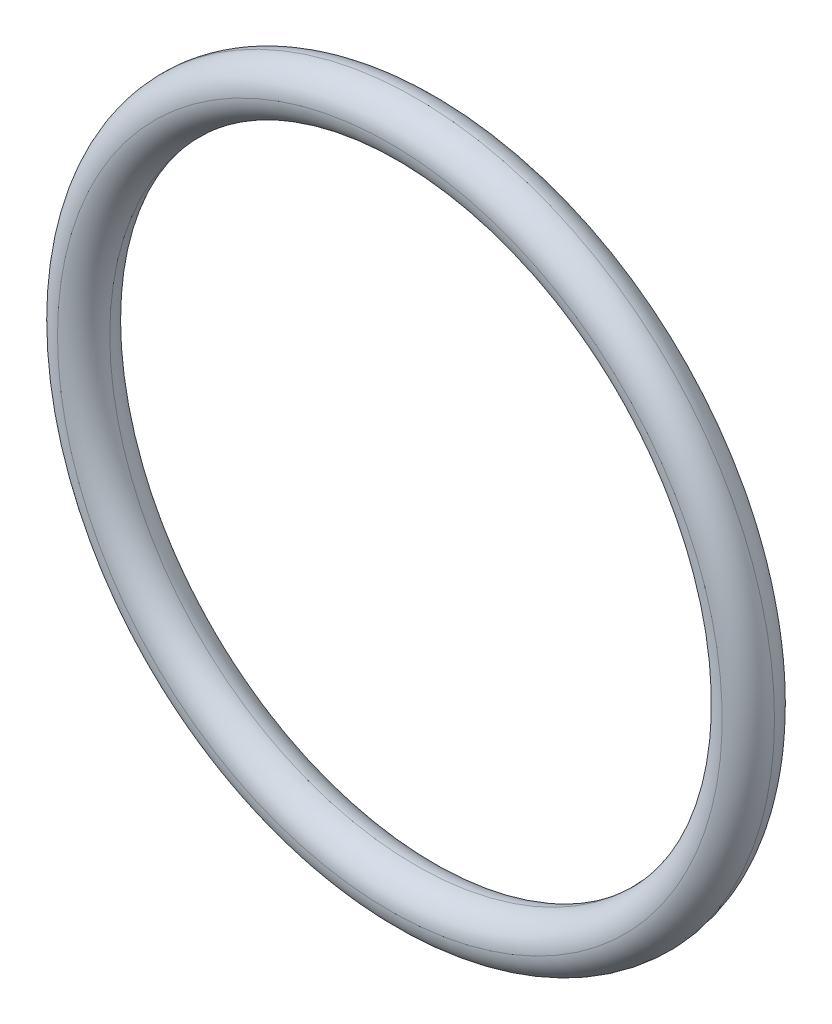
ISO-10303-21;
HEADER;
FILE_DESCRIPTION(('STEP AP214'),'2;1');
FILE_NAME('part.step','',(''),(''),'','','');
FILE_SCHEMA(('AUTOMOTIVE_DESIGN { 1 0 10303 214 1 1 1 1 }'));
ENDSEC;
DATA;
#1=APPLICATION_CONTEXT('core data for automotive mechanical design processes');
#2=APPLICATION_PROTOCOL_DEFINITION('international standard','automotive_design',2000,#1);
#3=PRODUCT_CONTEXT('',#1,'mechanical');
#4=PRODUCT('Part','Part','',(#3));
#5=PRODUCT_RELATED_PRODUCT_CATEGORY('part','',(#4));
#6=PRODUCT_DEFINITION_FORMATION('','',#4);
#7=PRODUCT_DEFINITION_CONTEXT('part definition',#1,'design');
#8=PRODUCT_DEFINITION('design','',#6,#7);
#9=PRODUCT_DEFINITION_SHAPE('','',#8);
#10=(LENGTH_UNIT() NAMED_UNIT(*) SI_UNIT(.MILLI.,.METRE.));
#11=(NAMED_UNIT(*) PLANE_ANGLE_UNIT() SI_UNIT($,.RADIAN.));
#12=(NAMED_UNIT(*) SI_UNIT($,.STERADIAN.) SOLID_ANGLE_UNIT());
#13=UNCERTAINTY_MEASURE_WITH_UNIT(LENGTH_MEASURE(1.E-05),#10,'distance_accuracy_value','');
#14=(GEOMETRIC_REPRESENTATION_CONTEXT(3) GLOBAL_UNCERTAINTY_ASSIGNED_CONTEXT((#13)) GLOBAL_UNIT_ASSIGNED_CONTEXT((#10,
#11,#12)) REPRESENTATION_CONTEXT('',''));
#15=CARTESIAN_POINT('',(0.,0.,0.));
#16=DIRECTION('',(0.,0.,1.));
#17=DIRECTION('',(1.,0.,0.));
#18=AXIS2_PLACEMENT_3D('',#15,#16,#17);
#19=CARTESIAN_POINT('',(13.5271785959933,-75.1852761095365,-15.6565540406377));
#20=DIRECTION('',(0.,0.,-1.));
#21=DIRECTION('',(-1.,0.,0.));
#22=AXIS2_PLACEMENT_3D('',#19,#20,#21);
#23=TOROIDAL_SURFACE('',#22,22.25,1.75);
#24=CARTESIAN_POINT('',(13.5271785959933,-75.1852761095365,-15.6565540406377));
#25=DIRECTION('',(0.,0.,-1.));
#26=DIRECTION('',(-1.,0.,0.));
#27=AXIS2_PLACEMENT_3D('',#24,#25,#26);
#28=CIRCLE('',#27,24.);
#29=CARTESIAN_POINT('',(-10.4728214040067,-75.1852761095365,-15.6565540406377));
#30=VERTEX_POINT('',#29);
#31=EDGE_CURVE('E38',#30,#30,#28,.F.);
#32=ORIENTED_EDGE('',*,*,#31,.F.);
#33=EDGE_LOOP('',(#32));
#34=FACE_BOUND('',#33,.T.);
#35=CARTESIAN_POINT('',(13.5271785959933,-75.1852761095365,-17.4065540406377));
#36=DIRECTION('',(0.,0.,-1.));
#37=DIRECTION('',(-1.,0.,0.));
#38=AXIS2_PLACEMENT_3D('',#35,#36,#37);
#39=CIRCLE('',#38,22.25);
#40=CARTESIAN_POINT('',(-8.72282140400669,-75.1852761095365,-17.4065540406377));
#41=VERTEX_POINT('',#40);
#42=EDGE_CURVE('E10',#41,#41,#39,.T.);
#43=ORIENTED_EDGE('',*,*,#42,.F.);
#44=EDGE_LOOP('',(#43));
#45=FACE_BOUND('',#44,.T.);
#46=ADVANCED_FACE('F32',(#34,#45),#23,.T.);
#47=CARTESIAN_POINT('',(13.5271785959933,-75.1852761095365,-15.6565540406377));
#48=DIRECTION('',(0.,0.,-1.));
#49=DIRECTION('',(-1.,0.,0.));
#50=AXIS2_PLACEMENT_3D('',#47,#48,#49);
#51=TOROIDAL_SURFACE('',#50,22.25,1.75);
#52=ORIENTED_EDGE('',*,*,#42,.T.);
#53=EDGE_LOOP('',(#52));
#54=FACE_BOUND('',#53,.T.);
#55=CARTESIAN_POINT('',(13.5271785959933,-75.1852761095365,-15.6565540406377));
#56=DIRECTION('',(0.,0.,-1.));
#57=DIRECTION('',(-1.,0.,0.));
#58=AXIS2_PLACEMENT_3D('',#55,#56,#57);
#59=CIRCLE('',#58,20.5);
#60=CARTESIAN_POINT('',(-6.9728214040067,-75.1852761095365,-15.6565540406377));
#61=VERTEX_POINT('',#60);
#62=EDGE_CURVE('E42',#61,#61,#59,.T.);
#63=ORIENTED_EDGE('',*,*,#62,.F.);
#64=EDGE_LOOP('',(#63));
#65=FACE_BOUND('',#64,.T.);
#66=ADVANCED_FACE('F56',(#54,#65),#51,.T.);
#67=CARTESIAN_POINT('',(13.5271785959933,-75.1852761095365,-15.6565540406377));
#68=DIRECTION('',(0.,0.,-1.));
#69=DIRECTION('',(-1.,0.,0.));
#70=AXIS2_PLACEMENT_3D('',#67,#68,#69);
#71=TOROIDAL_SURFACE('',#70,22.25,1.75);
#72=ORIENTED_EDGE('',*,*,#31,.T.);
#73=EDGE_LOOP('',(#72));
#74=FACE_BOUND('',#73,.T.);
#75=CARTESIAN_POINT('',(13.5271785959933,-75.1852761095365,-13.9065540406377));
#76=DIRECTION('',(0.,0.,-1.));
#77=DIRECTION('',(-1.,0.,0.));
#78=AXIS2_PLACEMENT_3D('',#75,#76,#77);
#79=CIRCLE('',#78,22.25);
#80=CARTESIAN_POINT('',(-8.72282140400669,-75.1852761095365,-13.9065540406377));
#81=VERTEX_POINT('',#80);
#82=EDGE_CURVE('E46',#81,#81,#79,.F.);
#83=ORIENTED_EDGE('',*,*,#82,.F.);
#84=EDGE_LOOP('',(#83));
#85=FACE_BOUND('',#84,.T.);
#86=ADVANCED_FACE('F54',(#74,#85),#71,.T.);
#87=CARTESIAN_POINT('',(13.5271785959933,-75.1852761095365,-15.6565540406377));
#88=DIRECTION('',(0.,0.,-1.));
#89=DIRECTION('',(-1.,0.,0.));
#90=AXIS2_PLACEMENT_3D('',#87,#88,#89);
#91=TOROIDAL_SURFACE('',#90,22.25,1.75);
#92=ORIENTED_EDGE('',*,*,#62,.T.);
#93=EDGE_LOOP('',(#92));
#94=FACE_BOUND('',#93,.T.);
#95=ORIENTED_EDGE('',*,*,#82,.T.);
#96=EDGE_LOOP('',(#95));
#97=FACE_BOUND('',#96,.T.);
#98=ADVANCED_FACE('F52',(#94,#97),#91,.T.);
#99=CLOSED_SHELL('',(#46,#66,#86,#98));
#100=MANIFOLD_SOLID_BREP('B2',#99);
#101=ADVANCED_BREP_SHAPE_REPRESENTATION('',(#18,#100),#14);
#102=SHAPE_DEFINITION_REPRESENTATION(#9,#101);
ENDSEC;
END-ISO-10303-21;
